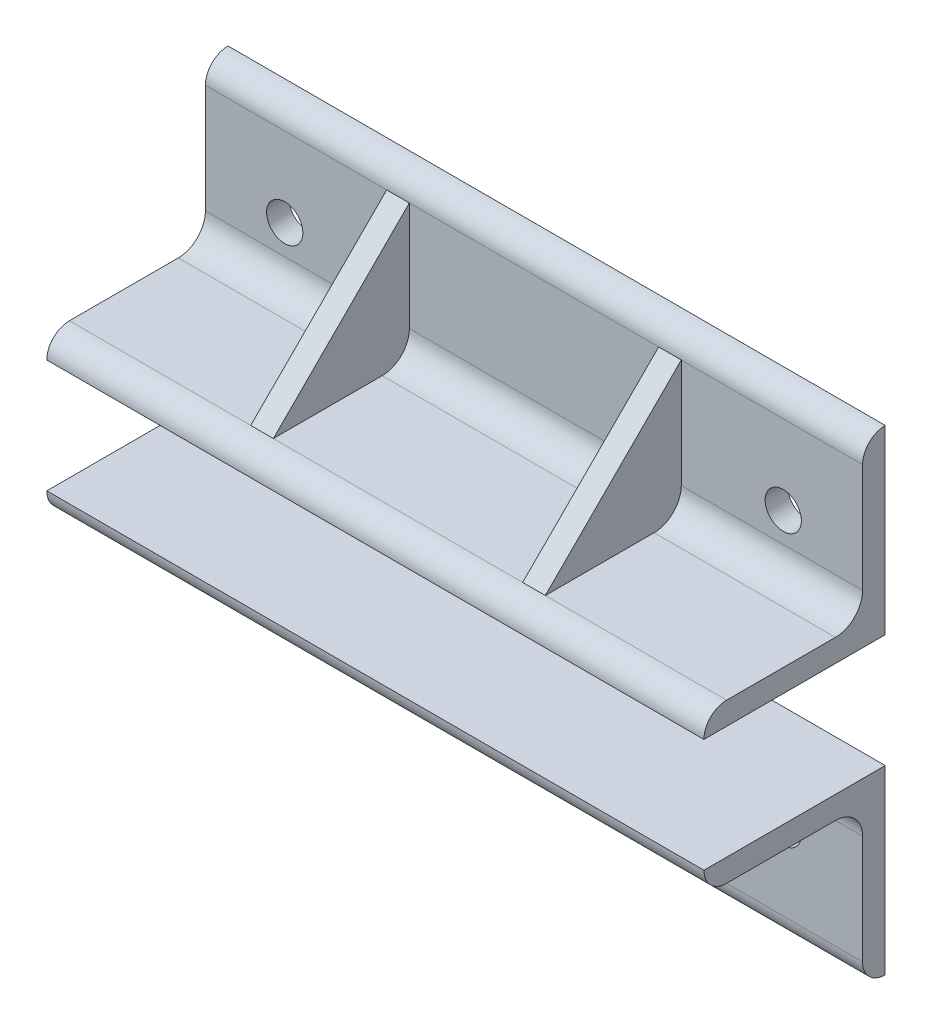
ISO-10303-21;
HEADER;
FILE_DESCRIPTION(('STEP AP214'),'2;1');
FILE_NAME('part.step','',(''),(''),'','','');
FILE_SCHEMA(('AUTOMOTIVE_DESIGN { 1 0 10303 214 1 1 1 1 }'));
ENDSEC;
DATA;
#1=APPLICATION_CONTEXT('core data for automotive mechanical design processes');
#2=APPLICATION_PROTOCOL_DEFINITION('international standard','automotive_design',2000,#1);
#3=PRODUCT_CONTEXT('',#1,'mechanical');
#4=PRODUCT('Part','Part','',(#3));
#5=PRODUCT_RELATED_PRODUCT_CATEGORY('part','',(#4));
#6=PRODUCT_DEFINITION_FORMATION('','',#4);
#7=PRODUCT_DEFINITION_CONTEXT('part definition',#1,'design');
#8=PRODUCT_DEFINITION('design','',#6,#7);
#9=PRODUCT_DEFINITION_SHAPE('','',#8);
#10=(LENGTH_UNIT() NAMED_UNIT(*) SI_UNIT(.MILLI.,.METRE.));
#11=(NAMED_UNIT(*) PLANE_ANGLE_UNIT() SI_UNIT($,.RADIAN.));
#12=(NAMED_UNIT(*) SI_UNIT($,.STERADIAN.) SOLID_ANGLE_UNIT());
#13=UNCERTAINTY_MEASURE_WITH_UNIT(LENGTH_MEASURE(1.E-05),#10,'distance_accuracy_value','');
#14=(GEOMETRIC_REPRESENTATION_CONTEXT(3) GLOBAL_UNCERTAINTY_ASSIGNED_CONTEXT((#13)) GLOBAL_UNIT_ASSIGNED_CONTEXT((#10,
#11,#12)) REPRESENTATION_CONTEXT('',''));
#15=CARTESIAN_POINT('',(0.,0.,0.));
#16=DIRECTION('',(0.,0.,1.));
#17=DIRECTION('',(1.,0.,0.));
#18=AXIS2_PLACEMENT_3D('',#15,#16,#17);
#19=CARTESIAN_POINT('',(-27.5,47.5,5.));
#20=DIRECTION('',(0.,-0.707106781186547,-0.707106781186548));
#21=DIRECTION('',(0.,0.707106781186548,-0.707106781186547));
#22=AXIS2_PLACEMENT_3D('',#19,#20,#21);
#23=PLANE('',#22);
#24=DIRECTION('',(0.,-0.707106781186547,0.707106781186547));
#25=VECTOR('',#24,1.);
#26=CARTESIAN_POINT('',(-32.5,47.5,5.));
#27=LINE('',#26,#25);
#28=CARTESIAN_POINT('',(-32.5,47.5,5.));
#29=VERTEX_POINT('',#28);
#30=CARTESIAN_POINT('',(-32.5,17.5,35.));
#31=VERTEX_POINT('',#30);
#32=EDGE_CURVE('E157',#29,#31,#27,.T.);
#33=ORIENTED_EDGE('',*,*,#32,.T.);
#34=DIRECTION('',(-1.,0.,0.));
#35=VECTOR('',#34,1.);
#36=CARTESIAN_POINT('',(-27.5,17.5,35.));
#37=LINE('',#36,#35);
#38=CARTESIAN_POINT('',(-27.5,17.5,35.));
#39=VERTEX_POINT('',#38);
#40=EDGE_CURVE('E14',#39,#31,#37,.T.);
#41=ORIENTED_EDGE('',*,*,#40,.F.);
#42=DIRECTION('',(0.,-0.707106781186547,0.707106781186547));
#43=VECTOR('',#42,1.);
#44=CARTESIAN_POINT('',(-27.5,47.5,5.));
#45=LINE('',#44,#43);
#46=CARTESIAN_POINT('',(-27.5,47.5,5.));
#47=VERTEX_POINT('',#46);
#48=EDGE_CURVE('E150',#47,#39,#45,.T.);
#49=ORIENTED_EDGE('',*,*,#48,.F.);
#50=DIRECTION('',(-1.,0.,0.));
#51=VECTOR('',#50,1.);
#52=CARTESIAN_POINT('',(-27.5,47.5,5.));
#53=LINE('',#52,#51);
#54=EDGE_CURVE('E158',#47,#29,#53,.T.);
#55=ORIENTED_EDGE('',*,*,#54,.T.);
#56=EDGE_LOOP('',(#33,#41,#49,#55));
#57=FACE_BOUND('',#56,.T.);
#58=ADVANCED_FACE('F110',(#57),#23,.F.);
#59=CARTESIAN_POINT('',(-27.5,17.5,5.));
#60=DIRECTION('',(0.,1.,0.));
#61=DIRECTION('',(0.,0.,1.));
#62=AXIS2_PLACEMENT_3D('',#59,#60,#61);
#63=PLANE('',#62);
#64=DIRECTION('',(0.,0.,-1.));
#65=VECTOR('',#64,1.);
#66=CARTESIAN_POINT('',(-32.5,17.5,5.));
#67=LINE('',#66,#65);
#68=CARTESIAN_POINT('',(-32.5,17.5,5.));
#69=VERTEX_POINT('',#68);
#70=EDGE_CURVE('E138',#31,#69,#67,.T.);
#71=ORIENTED_EDGE('',*,*,#70,.T.);
#72=DIRECTION('',(-1.,0.,0.));
#73=VECTOR('',#72,1.);
#74=CARTESIAN_POINT('',(-27.5,17.5,5.));
#75=LINE('',#74,#73);
#76=CARTESIAN_POINT('',(-27.5,17.5,5.));
#77=VERTEX_POINT('',#76);
#78=EDGE_CURVE('E118',#77,#69,#75,.T.);
#79=ORIENTED_EDGE('',*,*,#78,.F.);
#80=DIRECTION('',(0.,0.,-1.));
#81=VECTOR('',#80,1.);
#82=CARTESIAN_POINT('',(-27.5,17.5,5.));
#83=LINE('',#82,#81);
#84=EDGE_CURVE('E146',#39,#77,#83,.T.);
#85=ORIENTED_EDGE('',*,*,#84,.F.);
#86=ORIENTED_EDGE('',*,*,#40,.T.);
#87=EDGE_LOOP('',(#71,#79,#85,#86));
#88=FACE_BOUND('',#87,.T.);
#89=ADVANCED_FACE('F147',(#88),#63,.F.);
#90=CARTESIAN_POINT('',(-27.5,17.5,5.));
#91=DIRECTION('',(0.,0.,1.));
#92=DIRECTION('',(1.,0.,0.));
#93=AXIS2_PLACEMENT_3D('',#90,#91,#92);
#94=PLANE('',#93);
#95=DIRECTION('',(0.,1.,0.));
#96=VECTOR('',#95,1.);
#97=CARTESIAN_POINT('',(-32.5,17.5,5.));
#98=LINE('',#97,#96);
#99=EDGE_CURVE('E143',#69,#29,#98,.T.);
#100=ORIENTED_EDGE('',*,*,#99,.T.);
#101=ORIENTED_EDGE('',*,*,#54,.F.);
#102=DIRECTION('',(0.,1.,0.));
#103=VECTOR('',#102,1.);
#104=CARTESIAN_POINT('',(-27.5,17.5,5.));
#105=LINE('',#104,#103);
#106=EDGE_CURVE('E126',#77,#47,#105,.T.);
#107=ORIENTED_EDGE('',*,*,#106,.F.);
#108=ORIENTED_EDGE('',*,*,#78,.T.);
#109=EDGE_LOOP('',(#100,#101,#107,#108));
#110=FACE_BOUND('',#109,.T.);
#111=ADVANCED_FACE('F165',(#110),#94,.F.);
#112=CARTESIAN_POINT('',(-27.5,0.,0.));
#113=DIRECTION('',(-1.,0.,0.));
#114=DIRECTION('',(0.,0.,1.));
#115=AXIS2_PLACEMENT_3D('',#112,#113,#114);
#116=PLANE('',#115);
#117=ORIENTED_EDGE('',*,*,#48,.T.);
#118=ORIENTED_EDGE('',*,*,#84,.T.);
#119=ORIENTED_EDGE('',*,*,#106,.T.);
#120=EDGE_LOOP('',(#117,#118,#119));
#121=FACE_BOUND('',#120,.T.);
#122=ADVANCED_FACE('F153',(#121),#116,.F.);
#123=CARTESIAN_POINT('',(-32.5,0.,0.));
#124=DIRECTION('',(-1.,0.,0.));
#125=DIRECTION('',(0.,0.,1.));
#126=AXIS2_PLACEMENT_3D('',#123,#124,#125);
#127=PLANE('',#126);
#128=ORIENTED_EDGE('',*,*,#32,.F.);
#129=ORIENTED_EDGE('',*,*,#99,.F.);
#130=ORIENTED_EDGE('',*,*,#70,.F.);
#131=EDGE_LOOP('',(#128,#129,#130));
#132=FACE_BOUND('',#131,.T.);
#133=ADVANCED_FACE('F166',(#132),#127,.T.);
#134=CLOSED_SHELL('',(#58,#89,#111,#122,#133));
#135=MANIFOLD_SOLID_BREP('B2',#134);
#136=CARTESIAN_POINT('',(27.5,-47.5,4.99999999999988));
#137=DIRECTION('',(0.,0.70710678118655,-0.707106781186545));
#138=DIRECTION('',(0.,0.707106781186545,0.70710678118655));
#139=AXIS2_PLACEMENT_3D('',#136,#137,#138);
#140=PLANE('',#139);
#141=DIRECTION('',(0.,0.707106781186545,0.70710678118655));
#142=VECTOR('',#141,1.);
#143=CARTESIAN_POINT('',(32.5,-47.5,4.99999999999988));
#144=LINE('',#143,#142);
#145=CARTESIAN_POINT('',(32.5,-47.5,4.99999999999988));
#146=VERTEX_POINT('',#145);
#147=CARTESIAN_POINT('',(32.5,-17.5000000000001,35.));
#148=VERTEX_POINT('',#147);
#149=EDGE_CURVE('E265',#146,#148,#144,.T.);
#150=ORIENTED_EDGE('',*,*,#149,.T.);
#151=DIRECTION('',(1.,0.,0.));
#152=VECTOR('',#151,1.);
#153=CARTESIAN_POINT('',(27.5,-17.5000000000001,35.));
#154=LINE('',#153,#152);
#155=CARTESIAN_POINT('',(27.5,-17.5000000000001,35.));
#156=VERTEX_POINT('',#155);
#157=EDGE_CURVE('E108',#156,#148,#154,.T.);
#158=ORIENTED_EDGE('',*,*,#157,.F.);
#159=DIRECTION('',(0.,0.707106781186545,0.70710678118655));
#160=VECTOR('',#159,1.);
#161=CARTESIAN_POINT('',(27.5,-47.5,4.99999999999988));
#162=LINE('',#161,#160);
#163=CARTESIAN_POINT('',(27.5,-47.5,4.99999999999988));
#164=VERTEX_POINT('',#163);
#165=EDGE_CURVE('E258',#164,#156,#162,.T.);
#166=ORIENTED_EDGE('',*,*,#165,.F.);
#167=DIRECTION('',(1.,0.,0.));
#168=VECTOR('',#167,1.);
#169=CARTESIAN_POINT('',(27.5,-47.5,4.99999999999988));
#170=LINE('',#169,#168);
#171=EDGE_CURVE('E266',#164,#146,#170,.T.);
#172=ORIENTED_EDGE('',*,*,#171,.T.);
#173=EDGE_LOOP('',(#150,#158,#166,#172));
#174=FACE_BOUND('',#173,.T.);
#175=ADVANCED_FACE('F218',(#174),#140,.F.);
#176=CARTESIAN_POINT('',(27.5,-17.5,4.99999999999998));
#177=DIRECTION('',(0.,-1.,0.));
#178=DIRECTION('',(0.,0.,-1.));
#179=AXIS2_PLACEMENT_3D('',#176,#177,#178);
#180=PLANE('',#179);
#181=DIRECTION('',(0.,0.,-1.));
#182=VECTOR('',#181,1.);
#183=CARTESIAN_POINT('',(32.5,-17.5,4.99999999999998));
#184=LINE('',#183,#182);
#185=CARTESIAN_POINT('',(32.5,-17.5,4.99999999999998));
#186=VERTEX_POINT('',#185);
#187=EDGE_CURVE('E246',#148,#186,#184,.T.);
#188=ORIENTED_EDGE('',*,*,#187,.T.);
#189=DIRECTION('',(1.,0.,0.));
#190=VECTOR('',#189,1.);
#191=CARTESIAN_POINT('',(27.5,-17.5,4.99999999999998));
#192=LINE('',#191,#190);
#193=CARTESIAN_POINT('',(27.5,-17.5,4.99999999999998));
#194=VERTEX_POINT('',#193);
#195=EDGE_CURVE('E226',#194,#186,#192,.T.);
#196=ORIENTED_EDGE('',*,*,#195,.F.);
#197=DIRECTION('',(0.,0.,-1.));
#198=VECTOR('',#197,1.);
#199=CARTESIAN_POINT('',(27.5,-17.5,4.99999999999998));
#200=LINE('',#199,#198);
#201=EDGE_CURVE('E254',#156,#194,#200,.T.);
#202=ORIENTED_EDGE('',*,*,#201,.F.);
#203=ORIENTED_EDGE('',*,*,#157,.T.);
#204=EDGE_LOOP('',(#188,#196,#202,#203));
#205=FACE_BOUND('',#204,.T.);
#206=ADVANCED_FACE('F255',(#205),#180,.F.);
#207=CARTESIAN_POINT('',(27.5,-17.5,4.99999999999998));
#208=DIRECTION('',(0.,0.,1.));
#209=DIRECTION('',(0.,-1.,0.));
#210=AXIS2_PLACEMENT_3D('',#207,#208,#209);
#211=PLANE('',#210);
#212=DIRECTION('',(0.,-1.,0.));
#213=VECTOR('',#212,1.);
#214=CARTESIAN_POINT('',(32.5,-17.5,4.99999999999998));
#215=LINE('',#214,#213);
#216=EDGE_CURVE('E251',#186,#146,#215,.T.);
#217=ORIENTED_EDGE('',*,*,#216,.T.);
#218=ORIENTED_EDGE('',*,*,#171,.F.);
#219=DIRECTION('',(0.,-1.,0.));
#220=VECTOR('',#219,1.);
#221=CARTESIAN_POINT('',(27.5,-17.5,4.99999999999998));
#222=LINE('',#221,#220);
#223=EDGE_CURVE('E234',#194,#164,#222,.T.);
#224=ORIENTED_EDGE('',*,*,#223,.F.);
#225=ORIENTED_EDGE('',*,*,#195,.T.);
#226=EDGE_LOOP('',(#217,#218,#224,#225));
#227=FACE_BOUND('',#226,.T.);
#228=ADVANCED_FACE('F273',(#227),#211,.F.);
#229=CARTESIAN_POINT('',(27.5,0.,0.));
#230=DIRECTION('',(1.,0.,0.));
#231=DIRECTION('',(0.,0.,-1.));
#232=AXIS2_PLACEMENT_3D('',#229,#230,#231);
#233=PLANE('',#232);
#234=ORIENTED_EDGE('',*,*,#165,.T.);
#235=ORIENTED_EDGE('',*,*,#201,.T.);
#236=ORIENTED_EDGE('',*,*,#223,.T.);
#237=EDGE_LOOP('',(#234,#235,#236));
#238=FACE_BOUND('',#237,.T.);
#239=ADVANCED_FACE('F261',(#238),#233,.F.);
#240=CARTESIAN_POINT('',(32.5,0.,0.));
#241=DIRECTION('',(1.,0.,0.));
#242=DIRECTION('',(0.,0.,-1.));
#243=AXIS2_PLACEMENT_3D('',#240,#241,#242);
#244=PLANE('',#243);
#245=ORIENTED_EDGE('',*,*,#149,.F.);
#246=ORIENTED_EDGE('',*,*,#216,.F.);
#247=ORIENTED_EDGE('',*,*,#187,.F.);
#248=EDGE_LOOP('',(#245,#246,#247));
#249=FACE_BOUND('',#248,.T.);
#250=ADVANCED_FACE('F274',(#249),#244,.T.);
#251=CLOSED_SHELL('',(#175,#206,#228,#239,#250));
#252=MANIFOLD_SOLID_BREP('B8',#251);
#253=CARTESIAN_POINT('',(-30.,-17.5000000000001,35.));
#254=DIRECTION('',(0.,0.70710678118655,-0.707106781186545));
#255=DIRECTION('',(0.,0.707106781186545,0.70710678118655));
#256=AXIS2_PLACEMENT_3D('',#253,#254,#255);
#257=PLANE('',#256);
#258=DIRECTION('',(0.,-0.707106781186545,-0.70710678118655));
#259=VECTOR('',#258,1.);
#260=CARTESIAN_POINT('',(-35.,-17.5000000000001,35.));
#261=LINE('',#260,#259);
#262=CARTESIAN_POINT('',(-35.,-17.5000000000001,35.));
#263=VERTEX_POINT('',#262);
#264=CARTESIAN_POINT('',(-35.,-47.5,4.99999999999988));
#265=VERTEX_POINT('',#264);
#266=EDGE_CURVE('E373',#263,#265,#261,.T.);
#267=ORIENTED_EDGE('',*,*,#266,.T.);
#268=DIRECTION('',(-1.,0.,0.));
#269=VECTOR('',#268,1.);
#270=CARTESIAN_POINT('',(-30.,-47.5,4.99999999999988));
#271=LINE('',#270,#269);
#272=CARTESIAN_POINT('',(-30.,-47.5,4.99999999999988));
#273=VERTEX_POINT('',#272);
#274=EDGE_CURVE('E216',#273,#265,#271,.T.);
#275=ORIENTED_EDGE('',*,*,#274,.F.);
#276=DIRECTION('',(0.,-0.707106781186545,-0.70710678118655));
#277=VECTOR('',#276,1.);
#278=CARTESIAN_POINT('',(-30.,-17.5000000000001,35.));
#279=LINE('',#278,#277);
#280=CARTESIAN_POINT('',(-30.,-17.5000000000001,35.));
#281=VERTEX_POINT('',#280);
#282=EDGE_CURVE('E366',#281,#273,#279,.T.);
#283=ORIENTED_EDGE('',*,*,#282,.F.);
#284=DIRECTION('',(-1.,0.,0.));
#285=VECTOR('',#284,1.);
#286=CARTESIAN_POINT('',(-30.,-17.5000000000001,35.));
#287=LINE('',#286,#285);
#288=EDGE_CURVE('E374',#281,#263,#287,.T.);
#289=ORIENTED_EDGE('',*,*,#288,.T.);
#290=EDGE_LOOP('',(#267,#275,#283,#289));
#291=FACE_BOUND('',#290,.T.);
#292=ADVANCED_FACE('F326',(#291),#257,.F.);
#293=CARTESIAN_POINT('',(-30.,-17.5,4.99999999999998));
#294=DIRECTION('',(0.,0.,1.));
#295=DIRECTION('',(0.,-1.,0.));
#296=AXIS2_PLACEMENT_3D('',#293,#294,#295);
#297=PLANE('',#296);
#298=DIRECTION('',(0.,1.,0.));
#299=VECTOR('',#298,1.);
#300=CARTESIAN_POINT('',(-35.,-17.5,4.99999999999998));
#301=LINE('',#300,#299);
#302=CARTESIAN_POINT('',(-35.,-17.5,4.99999999999998));
#303=VERTEX_POINT('',#302);
#304=EDGE_CURVE('E354',#265,#303,#301,.T.);
#305=ORIENTED_EDGE('',*,*,#304,.T.);
#306=DIRECTION('',(-1.,0.,0.));
#307=VECTOR('',#306,1.);
#308=CARTESIAN_POINT('',(-30.,-17.5,4.99999999999998));
#309=LINE('',#308,#307);
#310=CARTESIAN_POINT('',(-30.,-17.5,4.99999999999998));
#311=VERTEX_POINT('',#310);
#312=EDGE_CURVE('E334',#311,#303,#309,.T.);
#313=ORIENTED_EDGE('',*,*,#312,.F.);
#314=DIRECTION('',(0.,1.,0.));
#315=VECTOR('',#314,1.);
#316=CARTESIAN_POINT('',(-30.,-17.5,4.99999999999998));
#317=LINE('',#316,#315);
#318=EDGE_CURVE('E362',#273,#311,#317,.T.);
#319=ORIENTED_EDGE('',*,*,#318,.F.);
#320=ORIENTED_EDGE('',*,*,#274,.T.);
#321=EDGE_LOOP('',(#305,#313,#319,#320));
#322=FACE_BOUND('',#321,.T.);
#323=ADVANCED_FACE('F363',(#322),#297,.F.);
#324=CARTESIAN_POINT('',(-30.,-17.5,4.99999999999998));
#325=DIRECTION('',(0.,-1.,0.));
#326=DIRECTION('',(0.,0.,-1.));
#327=AXIS2_PLACEMENT_3D('',#324,#325,#326);
#328=PLANE('',#327);
#329=DIRECTION('',(0.,0.,1.));
#330=VECTOR('',#329,1.);
#331=CARTESIAN_POINT('',(-35.,-17.5,4.99999999999998));
#332=LINE('',#331,#330);
#333=EDGE_CURVE('E359',#303,#263,#332,.T.);
#334=ORIENTED_EDGE('',*,*,#333,.T.);
#335=ORIENTED_EDGE('',*,*,#288,.F.);
#336=DIRECTION('',(0.,0.,1.));
#337=VECTOR('',#336,1.);
#338=CARTESIAN_POINT('',(-30.,-17.5,4.99999999999998));
#339=LINE('',#338,#337);
#340=EDGE_CURVE('E342',#311,#281,#339,.T.);
#341=ORIENTED_EDGE('',*,*,#340,.F.);
#342=ORIENTED_EDGE('',*,*,#312,.T.);
#343=EDGE_LOOP('',(#334,#335,#341,#342));
#344=FACE_BOUND('',#343,.T.);
#345=ADVANCED_FACE('F381',(#344),#328,.F.);
#346=CARTESIAN_POINT('',(-30.,0.,0.));
#347=DIRECTION('',(-1.,0.,0.));
#348=DIRECTION('',(0.,0.,1.));
#349=AXIS2_PLACEMENT_3D('',#346,#347,#348);
#350=PLANE('',#349);
#351=ORIENTED_EDGE('',*,*,#282,.T.);
#352=ORIENTED_EDGE('',*,*,#318,.T.);
#353=ORIENTED_EDGE('',*,*,#340,.T.);
#354=EDGE_LOOP('',(#351,#352,#353));
#355=FACE_BOUND('',#354,.T.);
#356=ADVANCED_FACE('F369',(#355),#350,.F.);
#357=CARTESIAN_POINT('',(-35.,0.,0.));
#358=DIRECTION('',(-1.,0.,0.));
#359=DIRECTION('',(0.,0.,1.));
#360=AXIS2_PLACEMENT_3D('',#357,#358,#359);
#361=PLANE('',#360);
#362=ORIENTED_EDGE('',*,*,#266,.F.);
#363=ORIENTED_EDGE('',*,*,#333,.F.);
#364=ORIENTED_EDGE('',*,*,#304,.F.);
#365=EDGE_LOOP('',(#362,#363,#364));
#366=FACE_BOUND('',#365,.T.);
#367=ADVANCED_FACE('F382',(#366),#361,.T.);
#368=CLOSED_SHELL('',(#292,#323,#345,#356,#367));
#369=MANIFOLD_SOLID_BREP('B102',#368);
#370=CARTESIAN_POINT('',(27.5,17.5,35.));
#371=DIRECTION('',(0.,-0.707106781186548,-0.707106781186548));
#372=DIRECTION('',(0.,0.707106781186548,-0.707106781186548));
#373=AXIS2_PLACEMENT_3D('',#370,#371,#372);
#374=PLANE('',#373);
#375=DIRECTION('',(0.,0.707106781186548,-0.707106781186548));
#376=VECTOR('',#375,1.);
#377=CARTESIAN_POINT('',(32.5,17.5,35.));
#378=LINE('',#377,#376);
#379=CARTESIAN_POINT('',(32.5,17.5,35.));
#380=VERTEX_POINT('',#379);
#381=CARTESIAN_POINT('',(32.5,47.5,5.));
#382=VERTEX_POINT('',#381);
#383=EDGE_CURVE('E483',#380,#382,#378,.T.);
#384=ORIENTED_EDGE('',*,*,#383,.T.);
#385=DIRECTION('',(1.,0.,0.));
#386=VECTOR('',#385,1.);
#387=CARTESIAN_POINT('',(27.5,47.5,5.));
#388=LINE('',#387,#386);
#389=CARTESIAN_POINT('',(27.5,47.5,5.));
#390=VERTEX_POINT('',#389);
#391=EDGE_CURVE('E324',#390,#382,#388,.T.);
#392=ORIENTED_EDGE('',*,*,#391,.F.);
#393=DIRECTION('',(0.,0.707106781186548,-0.707106781186548));
#394=VECTOR('',#393,1.);
#395=CARTESIAN_POINT('',(27.5,17.5,35.));
#396=LINE('',#395,#394);
#397=CARTESIAN_POINT('',(27.5,17.5,35.));
#398=VERTEX_POINT('',#397);
#399=EDGE_CURVE('E476',#398,#390,#396,.T.);
#400=ORIENTED_EDGE('',*,*,#399,.F.);
#401=DIRECTION('',(1.,0.,0.));
#402=VECTOR('',#401,1.);
#403=CARTESIAN_POINT('',(27.5,17.5,35.));
#404=LINE('',#403,#402);
#405=EDGE_CURVE('E484',#398,#380,#404,.T.);
#406=ORIENTED_EDGE('',*,*,#405,.T.);
#407=EDGE_LOOP('',(#384,#392,#400,#406));
#408=FACE_BOUND('',#407,.T.);
#409=ADVANCED_FACE('F436',(#408),#374,.F.);
#410=CARTESIAN_POINT('',(27.5,17.5,5.));
#411=DIRECTION('',(0.,0.,1.));
#412=DIRECTION('',(1.,0.,0.));
#413=AXIS2_PLACEMENT_3D('',#410,#411,#412);
#414=PLANE('',#413);
#415=DIRECTION('',(0.,-1.,0.));
#416=VECTOR('',#415,1.);
#417=CARTESIAN_POINT('',(32.5,17.5,5.));
#418=LINE('',#417,#416);
#419=CARTESIAN_POINT('',(32.5,17.5,5.));
#420=VERTEX_POINT('',#419);
#421=EDGE_CURVE('E464',#382,#420,#418,.T.);
#422=ORIENTED_EDGE('',*,*,#421,.T.);
#423=DIRECTION('',(1.,0.,0.));
#424=VECTOR('',#423,1.);
#425=CARTESIAN_POINT('',(27.5,17.5,5.));
#426=LINE('',#425,#424);
#427=CARTESIAN_POINT('',(27.5,17.5,5.));
#428=VERTEX_POINT('',#427);
#429=EDGE_CURVE('E444',#428,#420,#426,.T.);
#430=ORIENTED_EDGE('',*,*,#429,.F.);
#431=DIRECTION('',(0.,-1.,0.));
#432=VECTOR('',#431,1.);
#433=CARTESIAN_POINT('',(27.5,17.5,5.));
#434=LINE('',#433,#432);
#435=EDGE_CURVE('E472',#390,#428,#434,.T.);
#436=ORIENTED_EDGE('',*,*,#435,.F.);
#437=ORIENTED_EDGE('',*,*,#391,.T.);
#438=EDGE_LOOP('',(#422,#430,#436,#437));
#439=FACE_BOUND('',#438,.T.);
#440=ADVANCED_FACE('F473',(#439),#414,.F.);
#441=CARTESIAN_POINT('',(27.5,17.5,5.));
#442=DIRECTION('',(0.,1.,0.));
#443=DIRECTION('',(0.,0.,1.));
#444=AXIS2_PLACEMENT_3D('',#441,#442,#443);
#445=PLANE('',#444);
#446=DIRECTION('',(0.,0.,1.));
#447=VECTOR('',#446,1.);
#448=CARTESIAN_POINT('',(32.5,17.5,5.));
#449=LINE('',#448,#447);
#450=EDGE_CURVE('E469',#420,#380,#449,.T.);
#451=ORIENTED_EDGE('',*,*,#450,.T.);
#452=ORIENTED_EDGE('',*,*,#405,.F.);
#453=DIRECTION('',(0.,0.,1.));
#454=VECTOR('',#453,1.);
#455=CARTESIAN_POINT('',(27.5,17.5,5.));
#456=LINE('',#455,#454);
#457=EDGE_CURVE('E452',#428,#398,#456,.T.);
#458=ORIENTED_EDGE('',*,*,#457,.F.);
#459=ORIENTED_EDGE('',*,*,#429,.T.);
#460=EDGE_LOOP('',(#451,#452,#458,#459));
#461=FACE_BOUND('',#460,.T.);
#462=ADVANCED_FACE('F491',(#461),#445,.F.);
#463=CARTESIAN_POINT('',(27.5,0.,0.));
#464=DIRECTION('',(1.,0.,0.));
#465=DIRECTION('',(0.,0.,-1.));
#466=AXIS2_PLACEMENT_3D('',#463,#464,#465);
#467=PLANE('',#466);
#468=ORIENTED_EDGE('',*,*,#399,.T.);
#469=ORIENTED_EDGE('',*,*,#435,.T.);
#470=ORIENTED_EDGE('',*,*,#457,.T.);
#471=EDGE_LOOP('',(#468,#469,#470));
#472=FACE_BOUND('',#471,.T.);
#473=ADVANCED_FACE('F479',(#472),#467,.F.);
#474=CARTESIAN_POINT('',(32.5,0.,0.));
#475=DIRECTION('',(1.,0.,0.));
#476=DIRECTION('',(0.,0.,-1.));
#477=AXIS2_PLACEMENT_3D('',#474,#475,#476);
#478=PLANE('',#477);
#479=ORIENTED_EDGE('',*,*,#383,.F.);
#480=ORIENTED_EDGE('',*,*,#450,.F.);
#481=ORIENTED_EDGE('',*,*,#421,.F.);
#482=EDGE_LOOP('',(#479,#480,#481));
#483=FACE_BOUND('',#482,.T.);
#484=ADVANCED_FACE('F492',(#483),#478,.T.);
#485=CLOSED_SHELL('',(#409,#440,#462,#473,#484));
#486=MANIFOLD_SOLID_BREP('B210',#485);
#487=CARTESIAN_POINT('',(72.5,-12.5000000000001,40.));
#488=DIRECTION('',(0.,-1.,0.));
#489=DIRECTION('',(0.,0.,-1.));
#490=AXIS2_PLACEMENT_3D('',#487,#488,#489);
#491=PLANE('',#490);
#492=DIRECTION('',(0.,0.,1.));
#493=VECTOR('',#492,1.);
#494=CARTESIAN_POINT('',(-72.5,-12.5000000000001,40.));
#495=LINE('',#494,#493);
#496=CARTESIAN_POINT('',(-72.5,-12.5,0.));
#497=VERTEX_POINT('',#496);
#498=CARTESIAN_POINT('',(-72.5,-12.5000000000001,40.));
#499=VERTEX_POINT('',#498);
#500=EDGE_CURVE('E639',#497,#499,#495,.T.);
#501=ORIENTED_EDGE('',*,*,#500,.T.);
#502=DIRECTION('',(-1.,0.,0.));
#503=VECTOR('',#502,1.);
#504=CARTESIAN_POINT('',(72.5,-12.5000000000001,40.));
#505=LINE('',#504,#503);
#506=CARTESIAN_POINT('',(72.5,-12.5000000000001,40.));
#507=VERTEX_POINT('',#506);
#508=EDGE_CURVE('E434',#507,#499,#505,.T.);
#509=ORIENTED_EDGE('',*,*,#508,.F.);
#510=DIRECTION('',(0.,0.,1.));
#511=VECTOR('',#510,1.);
#512=CARTESIAN_POINT('',(72.5,-12.5000000000001,40.));
#513=LINE('',#512,#511);
#514=CARTESIAN_POINT('',(72.5,-12.5,0.));
#515=VERTEX_POINT('',#514);
#516=EDGE_CURVE('E652',#515,#507,#513,.T.);
#517=ORIENTED_EDGE('',*,*,#516,.F.);
#518=DIRECTION('',(-1.,0.,0.));
#519=VECTOR('',#518,1.);
#520=CARTESIAN_POINT('',(72.5,-12.5,0.));
#521=LINE('',#520,#519);
#522=EDGE_CURVE('E635',#515,#497,#521,.T.);
#523=ORIENTED_EDGE('',*,*,#522,.T.);
#524=EDGE_LOOP('',(#501,#509,#517,#523));
#525=FACE_BOUND('',#524,.T.);
#526=ADVANCED_FACE('F549',(#525),#491,.F.);
#527=CARTESIAN_POINT('',(72.5,-12.5000000000001,35.));
#528=DIRECTION('',(-1.,0.,0.));
#529=DIRECTION('',(0.,0.,1.));
#530=AXIS2_PLACEMENT_3D('',#527,#528,#529);
#531=CYLINDRICAL_SURFACE('',#530,5.);
#532=CARTESIAN_POINT('',(-72.5,-12.5000000000001,35.));
#533=DIRECTION('',(1.,0.,0.));
#534=DIRECTION('',(0.,0.,-1.));
#535=AXIS2_PLACEMENT_3D('',#532,#533,#534);
#536=CIRCLE('',#535,5.);
#537=CARTESIAN_POINT('',(-72.5,-17.5000000000001,35.));
#538=VERTEX_POINT('',#537);
#539=EDGE_CURVE('E642',#499,#538,#536,.T.);
#540=ORIENTED_EDGE('',*,*,#539,.T.);
#541=DIRECTION('',(-1.,0.,0.));
#542=VECTOR('',#541,1.);
#543=CARTESIAN_POINT('',(72.5,-17.5000000000001,35.));
#544=LINE('',#543,#542);
#545=CARTESIAN_POINT('',(72.5,-17.5000000000001,35.));
#546=VERTEX_POINT('',#545);
#547=EDGE_CURVE('E557',#546,#538,#544,.T.);
#548=ORIENTED_EDGE('',*,*,#547,.F.);
#549=CARTESIAN_POINT('',(72.5,-12.5000000000001,35.));
#550=DIRECTION('',(1.,0.,0.));
#551=DIRECTION('',(0.,0.,-1.));
#552=AXIS2_PLACEMENT_3D('',#549,#550,#551);
#553=CIRCLE('',#552,5.);
#554=EDGE_CURVE('E605',#507,#546,#553,.T.);
#555=ORIENTED_EDGE('',*,*,#554,.F.);
#556=ORIENTED_EDGE('',*,*,#508,.T.);
#557=EDGE_LOOP('',(#540,#548,#555,#556));
#558=FACE_BOUND('',#557,.T.);
#559=ADVANCED_FACE('F727',(#558),#531,.T.);
#560=CARTESIAN_POINT('',(72.5,-17.5,11.));
#561=DIRECTION('',(0.,1.,0.));
#562=DIRECTION('',(0.,0.,1.));
#563=AXIS2_PLACEMENT_3D('',#560,#561,#562);
#564=PLANE('',#563);
#565=DIRECTION('',(0.,0.,-1.));
#566=VECTOR('',#565,1.);
#567=CARTESIAN_POINT('',(-72.5,-17.5,11.));
#568=LINE('',#567,#566);
#569=CARTESIAN_POINT('',(-72.5,-17.5,11.));
#570=VERTEX_POINT('',#569);
#571=EDGE_CURVE('E645',#538,#570,#568,.T.);
#572=ORIENTED_EDGE('',*,*,#571,.T.);
#573=DIRECTION('',(-1.,0.,0.));
#574=VECTOR('',#573,1.);
#575=CARTESIAN_POINT('',(72.5,-17.5,11.));
#576=LINE('',#575,#574);
#577=CARTESIAN_POINT('',(72.5,-17.5,11.));
#578=VERTEX_POINT('',#577);
#579=EDGE_CURVE('E656',#578,#570,#576,.T.);
#580=ORIENTED_EDGE('',*,*,#579,.F.);
#581=DIRECTION('',(0.,0.,-1.));
#582=VECTOR('',#581,1.);
#583=CARTESIAN_POINT('',(72.5,-17.5,11.));
#584=LINE('',#583,#582);
#585=EDGE_CURVE('E664',#546,#578,#584,.T.);
#586=ORIENTED_EDGE('',*,*,#585,.F.);
#587=ORIENTED_EDGE('',*,*,#547,.T.);
#588=EDGE_LOOP('',(#572,#580,#586,#587));
#589=FACE_BOUND('',#588,.T.);
#590=ADVANCED_FACE('F662',(#589),#564,.F.);
#591=CARTESIAN_POINT('',(72.5,-23.5,11.));
#592=DIRECTION('',(-1.,0.,0.));
#593=DIRECTION('',(0.,0.,1.));
#594=AXIS2_PLACEMENT_3D('',#591,#592,#593);
#595=CYLINDRICAL_SURFACE('',#594,6.);
#596=CARTESIAN_POINT('',(-72.5,-23.5,11.));
#597=DIRECTION('',(-1.,0.,0.));
#598=DIRECTION('',(0.,0.,1.));
#599=AXIS2_PLACEMENT_3D('',#596,#597,#598);
#600=CIRCLE('',#599,6.);
#601=CARTESIAN_POINT('',(-72.5,-23.5,4.99999999999996));
#602=VERTEX_POINT('',#601);
#603=EDGE_CURVE('E647',#570,#602,#600,.T.);
#604=ORIENTED_EDGE('',*,*,#603,.T.);
#605=DIRECTION('',(-1.,0.,0.));
#606=VECTOR('',#605,1.);
#607=CARTESIAN_POINT('',(72.5,-23.5,4.99999999999996));
#608=LINE('',#607,#606);
#609=CARTESIAN_POINT('',(72.5,-23.5,4.99999999999996));
#610=VERTEX_POINT('',#609);
#611=EDGE_CURVE('E630',#610,#602,#608,.T.);
#612=ORIENTED_EDGE('',*,*,#611,.F.);
#613=CARTESIAN_POINT('',(72.5,-23.5,11.));
#614=DIRECTION('',(-1.,0.,0.));
#615=DIRECTION('',(0.,0.,1.));
#616=AXIS2_PLACEMENT_3D('',#613,#614,#615);
#617=CIRCLE('',#616,6.);
#618=EDGE_CURVE('E621',#578,#610,#617,.T.);
#619=ORIENTED_EDGE('',*,*,#618,.F.);
#620=ORIENTED_EDGE('',*,*,#579,.T.);
#621=EDGE_LOOP('',(#604,#612,#619,#620));
#622=FACE_BOUND('',#621,.T.);
#623=ADVANCED_FACE('F670',(#622),#595,.F.);
#624=CARTESIAN_POINT('',(72.5,-47.5,4.99999999999988));
#625=DIRECTION('',(0.,0.,-1.));
#626=DIRECTION('',(0.,1.,0.));
#627=AXIS2_PLACEMENT_3D('',#624,#625,#626);
#628=PLANE('',#627);
#629=CARTESIAN_POINT('',(-15.,-41.4999999999995,5.));
#630=DIRECTION('',(0.,0.,1.));
#631=DIRECTION('',(1.,0.,0.));
#632=AXIS2_PLACEMENT_3D('',#629,#630,#631);
#633=CIRCLE('',#632,4.24999999999999);
#634=CARTESIAN_POINT('',(-10.75,-41.4999999999995,5.));
#635=VERTEX_POINT('',#634);
#636=EDGE_CURVE('E690',#635,#635,#633,.T.);
#637=ORIENTED_EDGE('',*,*,#636,.F.);
#638=EDGE_LOOP('',(#637));
#639=FACE_BOUND('',#638,.T.);
#640=CARTESIAN_POINT('',(15.0000000000047,-41.4999999999995,5.));
#641=DIRECTION('',(0.,0.,1.));
#642=DIRECTION('',(-1.,0.,0.));
#643=AXIS2_PLACEMENT_3D('',#640,#641,#642);
#644=CIRCLE('',#643,4.24999999999999);
#645=CARTESIAN_POINT('',(10.7500000000047,-41.4999999999995,5.));
#646=VERTEX_POINT('',#645);
#647=EDGE_CURVE('E691',#646,#646,#644,.T.);
#648=ORIENTED_EDGE('',*,*,#647,.F.);
#649=EDGE_LOOP('',(#648));
#650=FACE_BOUND('',#649,.T.);
#651=CARTESIAN_POINT('',(55.,-30.,4.99999999999994));
#652=DIRECTION('',(0.,0.,-1.));
#653=DIRECTION('',(0.,1.,0.));
#654=AXIS2_PLACEMENT_3D('',#651,#652,#653);
#655=CIRCLE('',#654,4.00000000000001);
#656=CARTESIAN_POINT('',(55.,-26.,4.99999999999996));
#657=VERTEX_POINT('',#656);
#658=EDGE_CURVE('E682',#657,#657,#655,.T.);
#659=ORIENTED_EDGE('',*,*,#658,.T.);
#660=EDGE_LOOP('',(#659));
#661=FACE_BOUND('',#660,.T.);
#662=CARTESIAN_POINT('',(-55.,-30.,4.99999999999994));
#663=DIRECTION('',(0.,0.,-1.));
#664=DIRECTION('',(0.,1.,0.));
#665=AXIS2_PLACEMENT_3D('',#662,#663,#664);
#666=CIRCLE('',#665,4.00000000000001);
#667=CARTESIAN_POINT('',(-55.,-26.,4.99999999999996));
#668=VERTEX_POINT('',#667);
#669=EDGE_CURVE('E675',#668,#668,#666,.T.);
#670=ORIENTED_EDGE('',*,*,#669,.T.);
#671=EDGE_LOOP('',(#670));
#672=FACE_BOUND('',#671,.T.);
#673=DIRECTION('',(0.,-1.,0.));
#674=VECTOR('',#673,1.);
#675=CARTESIAN_POINT('',(-72.5,-47.5,4.99999999999988));
#676=LINE('',#675,#674);
#677=CARTESIAN_POINT('',(-72.5,-47.5,4.99999999999988));
#678=VERTEX_POINT('',#677);
#679=EDGE_CURVE('E629',#602,#678,#676,.T.);
#680=ORIENTED_EDGE('',*,*,#679,.T.);
#681=DIRECTION('',(-1.,0.,0.));
#682=VECTOR('',#681,1.);
#683=CARTESIAN_POINT('',(72.5,-47.5,4.99999999999988));
#684=LINE('',#683,#682);
#685=CARTESIAN_POINT('',(72.5,-47.5,4.99999999999988));
#686=VERTEX_POINT('',#685);
#687=EDGE_CURVE('E626',#686,#678,#684,.T.);
#688=ORIENTED_EDGE('',*,*,#687,.F.);
#689=DIRECTION('',(0.,-1.,0.));
#690=VECTOR('',#689,1.);
#691=CARTESIAN_POINT('',(72.5,-47.5,4.99999999999988));
#692=LINE('',#691,#690);
#693=EDGE_CURVE('E615',#610,#686,#692,.T.);
#694=ORIENTED_EDGE('',*,*,#693,.F.);
#695=ORIENTED_EDGE('',*,*,#611,.T.);
#696=EDGE_LOOP('',(#680,#688,#694,#695));
#697=FACE_BOUND('',#696,.T.);
#698=ADVANCED_FACE('F627',(#639,#650,#661,#672,#697),#628,.F.);
#699=CARTESIAN_POINT('',(72.5,-47.5,-1.21430643318376E-13));
#700=DIRECTION('',(-1.,0.,0.));
#701=DIRECTION('',(0.,0.,1.));
#702=AXIS2_PLACEMENT_3D('',#699,#700,#701);
#703=CYLINDRICAL_SURFACE('',#702,5.);
#704=CARTESIAN_POINT('',(-72.5,-47.5,-1.21430643318376E-13));
#705=DIRECTION('',(1.,0.,0.));
#706=DIRECTION('',(0.,0.,-1.));
#707=AXIS2_PLACEMENT_3D('',#704,#705,#706);
#708=CIRCLE('',#707,5.);
#709=CARTESIAN_POINT('',(-72.5,-52.5,-1.38777878078145E-13));
#710=VERTEX_POINT('',#709);
#711=EDGE_CURVE('E591',#678,#710,#708,.T.);
#712=ORIENTED_EDGE('',*,*,#711,.T.);
#713=DIRECTION('',(-1.,0.,0.));
#714=VECTOR('',#713,1.);
#715=CARTESIAN_POINT('',(72.5,-52.5,-1.38777878078145E-13));
#716=LINE('',#715,#714);
#717=CARTESIAN_POINT('',(72.5,-52.5,-1.38777878078145E-13));
#718=VERTEX_POINT('',#717);
#719=EDGE_CURVE('E631',#718,#710,#716,.T.);
#720=ORIENTED_EDGE('',*,*,#719,.F.);
#721=CARTESIAN_POINT('',(72.5,-47.5,-1.21430643318376E-13));
#722=DIRECTION('',(1.,0.,0.));
#723=DIRECTION('',(0.,0.,-1.));
#724=AXIS2_PLACEMENT_3D('',#721,#722,#723);
#725=CIRCLE('',#724,5.);
#726=EDGE_CURVE('E619',#686,#718,#725,.T.);
#727=ORIENTED_EDGE('',*,*,#726,.F.);
#728=ORIENTED_EDGE('',*,*,#687,.T.);
#729=EDGE_LOOP('',(#712,#720,#727,#728));
#730=FACE_BOUND('',#729,.T.);
#731=ADVANCED_FACE('F633',(#730),#703,.T.);
#732=CARTESIAN_POINT('',(72.5,-52.5,-1.38777878078145E-13));
#733=DIRECTION('',(0.,0.,1.));
#734=DIRECTION('',(0.,-1.,0.));
#735=AXIS2_PLACEMENT_3D('',#732,#733,#734);
#736=PLANE('',#735);
#737=CARTESIAN_POINT('',(-15.,-41.4999999999995,-1.00613961606655E-13));
#738=DIRECTION('',(0.,0.,1.));
#739=DIRECTION('',(0.,-1.,0.));
#740=AXIS2_PLACEMENT_3D('',#737,#738,#739);
#741=CIRCLE('',#740,4.24999999999999);
#742=CARTESIAN_POINT('',(-15.,-45.7499999999995,-1.15452757296738E-13));
#743=VERTEX_POINT('',#742);
#744=EDGE_CURVE('E679',#743,#743,#741,.F.);
#745=ORIENTED_EDGE('',*,*,#744,.F.);
#746=EDGE_LOOP('',(#745));
#747=FACE_BOUND('',#746,.T.);
#748=CARTESIAN_POINT('',(15.0000000000047,-41.4999999999995,-1.00613961606655E-13));
#749=DIRECTION('',(0.,0.,1.));
#750=DIRECTION('',(0.,-1.,0.));
#751=AXIS2_PLACEMENT_3D('',#748,#749,#750);
#752=CIRCLE('',#751,4.24999999999999);
#753=CARTESIAN_POINT('',(15.0000000000047,-45.7499999999995,-1.15452757296738E-13));
#754=VERTEX_POINT('',#753);
#755=EDGE_CURVE('E687',#754,#754,#752,.F.);
#756=ORIENTED_EDGE('',*,*,#755,.F.);
#757=EDGE_LOOP('',(#756));
#758=FACE_BOUND('',#757,.T.);
#759=CARTESIAN_POINT('',(55.,-30.,0.));
#760=DIRECTION('',(0.,0.,1.));
#761=DIRECTION('',(1.,0.,0.));
#762=AXIS2_PLACEMENT_3D('',#759,#760,#761);
#763=CIRCLE('',#762,4.00000000000001);
#764=CARTESIAN_POINT('',(59.,-30.,0.));
#765=VERTEX_POINT('',#764);
#766=EDGE_CURVE('E643',#765,#765,#763,.T.);
#767=ORIENTED_EDGE('',*,*,#766,.T.);
#768=EDGE_LOOP('',(#767));
#769=FACE_BOUND('',#768,.T.);
#770=CARTESIAN_POINT('',(-55.,-30.,0.));
#771=DIRECTION('',(0.,0.,1.));
#772=DIRECTION('',(1.,0.,0.));
#773=AXIS2_PLACEMENT_3D('',#770,#771,#772);
#774=CIRCLE('',#773,4.00000000000001);
#775=CARTESIAN_POINT('',(-51.,-30.,0.));
#776=VERTEX_POINT('',#775);
#777=EDGE_CURVE('E678',#776,#776,#774,.T.);
#778=ORIENTED_EDGE('',*,*,#777,.T.);
#779=EDGE_LOOP('',(#778));
#780=FACE_BOUND('',#779,.T.);
#781=DIRECTION('',(0.,1.,0.));
#782=VECTOR('',#781,1.);
#783=CARTESIAN_POINT('',(-72.5,-52.5,-1.38777878078145E-13));
#784=LINE('',#783,#782);
#785=EDGE_CURVE('E597',#710,#497,#784,.T.);
#786=ORIENTED_EDGE('',*,*,#785,.T.);
#787=ORIENTED_EDGE('',*,*,#522,.F.);
#788=DIRECTION('',(0.,1.,0.));
#789=VECTOR('',#788,1.);
#790=CARTESIAN_POINT('',(72.5,-52.5,-1.38777878078145E-13));
#791=LINE('',#790,#789);
#792=EDGE_CURVE('E565',#718,#515,#791,.T.);
#793=ORIENTED_EDGE('',*,*,#792,.F.);
#794=ORIENTED_EDGE('',*,*,#719,.T.);
#795=EDGE_LOOP('',(#786,#787,#793,#794));
#796=FACE_BOUND('',#795,.T.);
#797=ADVANCED_FACE('F734',(#747,#758,#769,#780,#796),#736,.F.);
#798=CARTESIAN_POINT('',(72.5,-47.5,-1.21430643318376E-13));
#799=DIRECTION('',(1.,0.,0.));
#800=DIRECTION('',(0.,0.,-1.));
#801=AXIS2_PLACEMENT_3D('',#798,#799,#800);
#802=PLANE('',#801);
#803=ORIENTED_EDGE('',*,*,#516,.T.);
#804=ORIENTED_EDGE('',*,*,#554,.T.);
#805=ORIENTED_EDGE('',*,*,#585,.T.);
#806=ORIENTED_EDGE('',*,*,#618,.T.);
#807=ORIENTED_EDGE('',*,*,#693,.T.);
#808=ORIENTED_EDGE('',*,*,#726,.T.);
#809=ORIENTED_EDGE('',*,*,#792,.T.);
#810=EDGE_LOOP('',(#803,#804,#805,#806,#807,#808,#809));
#811=FACE_BOUND('',#810,.T.);
#812=ADVANCED_FACE('F617',(#811),#802,.T.);
#813=CARTESIAN_POINT('',(-72.5,-47.5,-1.21430643318376E-13));
#814=DIRECTION('',(1.,0.,0.));
#815=DIRECTION('',(0.,0.,-1.));
#816=AXIS2_PLACEMENT_3D('',#813,#814,#815);
#817=PLANE('',#816);
#818=ORIENTED_EDGE('',*,*,#500,.F.);
#819=ORIENTED_EDGE('',*,*,#785,.F.);
#820=ORIENTED_EDGE('',*,*,#711,.F.);
#821=ORIENTED_EDGE('',*,*,#679,.F.);
#822=ORIENTED_EDGE('',*,*,#603,.F.);
#823=ORIENTED_EDGE('',*,*,#571,.F.);
#824=ORIENTED_EDGE('',*,*,#539,.F.);
#825=EDGE_LOOP('',(#818,#819,#820,#821,#822,#823,#824));
#826=FACE_BOUND('',#825,.T.);
#827=ADVANCED_FACE('F668',(#826),#817,.F.);
#828=CARTESIAN_POINT('',(-55.,-30.,40.001));
#829=DIRECTION('',(0.,0.,-1.));
#830=DIRECTION('',(-1.,0.,0.));
#831=AXIS2_PLACEMENT_3D('',#828,#829,#830);
#832=CYLINDRICAL_SURFACE('',#831,4.00000000000001);
#833=ORIENTED_EDGE('',*,*,#777,.F.);
#834=EDGE_LOOP('',(#833));
#835=FACE_BOUND('',#834,.T.);
#836=ORIENTED_EDGE('',*,*,#669,.F.);
#837=EDGE_LOOP('',(#836));
#838=FACE_BOUND('',#837,.T.);
#839=ADVANCED_FACE('F711',(#835,#838),#832,.F.);
#840=CARTESIAN_POINT('',(55.,-30.,40.001));
#841=DIRECTION('',(0.,0.,-1.));
#842=DIRECTION('',(-1.,0.,0.));
#843=AXIS2_PLACEMENT_3D('',#840,#841,#842);
#844=CYLINDRICAL_SURFACE('',#843,4.00000000000001);
#845=ORIENTED_EDGE('',*,*,#766,.F.);
#846=EDGE_LOOP('',(#845));
#847=FACE_BOUND('',#846,.T.);
#848=ORIENTED_EDGE('',*,*,#658,.F.);
#849=EDGE_LOOP('',(#848));
#850=FACE_BOUND('',#849,.T.);
#851=ADVANCED_FACE('F713',(#847,#850),#844,.F.);
#852=CARTESIAN_POINT('',(15.0000000000047,-41.4999999999995,-0.00100000000013978));
#853=DIRECTION('',(0.,0.,1.));
#854=DIRECTION('',(1.,0.,0.));
#855=AXIS2_PLACEMENT_3D('',#852,#853,#854);
#856=CYLINDRICAL_SURFACE('',#855,4.24999999999999);
#857=ORIENTED_EDGE('',*,*,#647,.T.);
#858=EDGE_LOOP('',(#857));
#859=FACE_BOUND('',#858,.T.);
#860=ORIENTED_EDGE('',*,*,#755,.T.);
#861=EDGE_LOOP('',(#860));
#862=FACE_BOUND('',#861,.T.);
#863=ADVANCED_FACE('F720',(#859,#862),#856,.F.);
#864=CARTESIAN_POINT('',(-15.,-41.4999999999995,-0.00100000000013978));
#865=DIRECTION('',(0.,0.,1.));
#866=DIRECTION('',(1.,0.,0.));
#867=AXIS2_PLACEMENT_3D('',#864,#865,#866);
#868=CYLINDRICAL_SURFACE('',#867,4.24999999999999);
#869=ORIENTED_EDGE('',*,*,#636,.T.);
#870=EDGE_LOOP('',(#869));
#871=FACE_BOUND('',#870,.T.);
#872=ORIENTED_EDGE('',*,*,#744,.T.);
#873=EDGE_LOOP('',(#872));
#874=FACE_BOUND('',#873,.T.);
#875=ADVANCED_FACE('F699',(#871,#874),#868,.F.);
#876=CLOSED_SHELL('',(#526,#559,#590,#623,#698,#731,#797,#812,#827,#839,#851,#863,#875));
#877=MANIFOLD_SOLID_BREP('B318',#876);
#878=CARTESIAN_POINT('',(72.5,52.5,0.));
#879=DIRECTION('',(0.,0.,1.));
#880=DIRECTION('',(1.,0.,0.));
#881=AXIS2_PLACEMENT_3D('',#878,#879,#880);
#882=PLANE('',#881);
#883=CARTESIAN_POINT('',(-55.,30.,0.));
#884=DIRECTION('',(0.,0.,1.));
#885=DIRECTION('',(1.,0.,0.));
#886=AXIS2_PLACEMENT_3D('',#883,#884,#885);
#887=CIRCLE('',#886,4.00000000000001);
#888=CARTESIAN_POINT('',(-51.,30.,0.));
#889=VERTEX_POINT('',#888);
#890=EDGE_CURVE('E947',#889,#889,#887,.T.);
#891=ORIENTED_EDGE('',*,*,#890,.T.);
#892=EDGE_LOOP('',(#891));
#893=FACE_BOUND('',#892,.T.);
#894=CARTESIAN_POINT('',(55.,30.,0.));
#895=DIRECTION('',(0.,0.,1.));
#896=DIRECTION('',(1.,0.,0.));
#897=AXIS2_PLACEMENT_3D('',#894,#895,#896);
#898=CIRCLE('',#897,4.00000000000001);
#899=CARTESIAN_POINT('',(59.,30.,0.));
#900=VERTEX_POINT('',#899);
#901=EDGE_CURVE('E982',#900,#900,#898,.T.);
#902=ORIENTED_EDGE('',*,*,#901,.T.);
#903=EDGE_LOOP('',(#902));
#904=FACE_BOUND('',#903,.T.);
#905=DIRECTION('',(0.,1.,0.));
#906=VECTOR('',#905,1.);
#907=CARTESIAN_POINT('',(-72.5,52.5,0.));
#908=LINE('',#907,#906);
#909=CARTESIAN_POINT('',(-72.5,12.5,0.));
#910=VERTEX_POINT('',#909);
#911=CARTESIAN_POINT('',(-72.5,52.5,0.));
#912=VERTEX_POINT('',#911);
#913=EDGE_CURVE('E943',#910,#912,#908,.T.);
#914=ORIENTED_EDGE('',*,*,#913,.T.);
#915=DIRECTION('',(-1.,0.,0.));
#916=VECTOR('',#915,1.);
#917=CARTESIAN_POINT('',(72.5,52.5,0.));
#918=LINE('',#917,#916);
#919=CARTESIAN_POINT('',(72.5,52.5,0.));
#920=VERTEX_POINT('',#919);
#921=EDGE_CURVE('E547',#920,#912,#918,.T.);
#922=ORIENTED_EDGE('',*,*,#921,.F.);
#923=DIRECTION('',(0.,1.,0.));
#924=VECTOR('',#923,1.);
#925=CARTESIAN_POINT('',(72.5,52.5,0.));
#926=LINE('',#925,#924);
#927=CARTESIAN_POINT('',(72.5,12.5,0.));
#928=VERTEX_POINT('',#927);
#929=EDGE_CURVE('E956',#928,#920,#926,.T.);
#930=ORIENTED_EDGE('',*,*,#929,.F.);
#931=DIRECTION('',(-1.,0.,0.));
#932=VECTOR('',#931,1.);
#933=CARTESIAN_POINT('',(72.5,12.5,0.));
#934=LINE('',#933,#932);
#935=EDGE_CURVE('E939',#928,#910,#934,.T.);
#936=ORIENTED_EDGE('',*,*,#935,.T.);
#937=EDGE_LOOP('',(#914,#922,#930,#936));
#938=FACE_BOUND('',#937,.T.);
#939=ADVANCED_FACE('F853',(#893,#904,#938),#882,.F.);
#940=CARTESIAN_POINT('',(72.5,47.5,0.));
#941=DIRECTION('',(-1.,0.,0.));
#942=DIRECTION('',(0.,0.,1.));
#943=AXIS2_PLACEMENT_3D('',#940,#941,#942);
#944=CYLINDRICAL_SURFACE('',#943,5.);
#945=CARTESIAN_POINT('',(-72.5,47.5,0.));
#946=DIRECTION('',(1.,0.,0.));
#947=DIRECTION('',(0.,0.,-1.));
#948=AXIS2_PLACEMENT_3D('',#945,#946,#947);
#949=CIRCLE('',#948,5.);
#950=CARTESIAN_POINT('',(-72.5,47.5,5.));
#951=VERTEX_POINT('',#950);
#952=EDGE_CURVE('E946',#912,#951,#949,.T.);
#953=ORIENTED_EDGE('',*,*,#952,.T.);
#954=DIRECTION('',(-1.,0.,0.));
#955=VECTOR('',#954,1.);
#956=CARTESIAN_POINT('',(72.5,47.5,5.));
#957=LINE('',#956,#955);
#958=CARTESIAN_POINT('',(72.5,47.5,5.));
#959=VERTEX_POINT('',#958);
#960=EDGE_CURVE('E861',#959,#951,#957,.T.);
#961=ORIENTED_EDGE('',*,*,#960,.F.);
#962=CARTESIAN_POINT('',(72.5,47.5,0.));
#963=DIRECTION('',(1.,0.,0.));
#964=DIRECTION('',(0.,0.,-1.));
#965=AXIS2_PLACEMENT_3D('',#962,#963,#964);
#966=CIRCLE('',#965,5.);
#967=EDGE_CURVE('E909',#920,#959,#966,.T.);
#968=ORIENTED_EDGE('',*,*,#967,.F.);
#969=ORIENTED_EDGE('',*,*,#921,.T.);
#970=EDGE_LOOP('',(#953,#961,#968,#969));
#971=FACE_BOUND('',#970,.T.);
#972=ADVANCED_FACE('F1002',(#971),#944,.T.);
#973=CARTESIAN_POINT('',(72.5,23.5,5.));
#974=DIRECTION('',(0.,0.,-1.));
#975=DIRECTION('',(-1.,0.,0.));
#976=AXIS2_PLACEMENT_3D('',#973,#974,#975);
#977=PLANE('',#976);
#978=CARTESIAN_POINT('',(-55.,30.,5.));
#979=DIRECTION('',(0.,0.,-1.));
#980=DIRECTION('',(-1.,0.,0.));
#981=AXIS2_PLACEMENT_3D('',#978,#979,#980);
#982=CIRCLE('',#981,4.00000000000001);
#983=CARTESIAN_POINT('',(-59.,30.,5.));
#984=VERTEX_POINT('',#983);
#985=EDGE_CURVE('E985',#984,#984,#982,.T.);
#986=ORIENTED_EDGE('',*,*,#985,.T.);
#987=EDGE_LOOP('',(#986));
#988=FACE_BOUND('',#987,.T.);
#989=CARTESIAN_POINT('',(55.,30.,5.));
#990=DIRECTION('',(0.,0.,-1.));
#991=DIRECTION('',(-1.,0.,0.));
#992=AXIS2_PLACEMENT_3D('',#989,#990,#991);
#993=CIRCLE('',#992,4.00000000000001);
#994=CARTESIAN_POINT('',(51.,30.,5.));
#995=VERTEX_POINT('',#994);
#996=EDGE_CURVE('E979',#995,#995,#993,.T.);
#997=ORIENTED_EDGE('',*,*,#996,.T.);
#998=EDGE_LOOP('',(#997));
#999=FACE_BOUND('',#998,.T.);
#1000=DIRECTION('',(0.,-1.,0.));
#1001=VECTOR('',#1000,1.);
#1002=CARTESIAN_POINT('',(-72.5,23.5,5.));
#1003=LINE('',#1002,#1001);
#1004=CARTESIAN_POINT('',(-72.5,23.5,5.));
#1005=VERTEX_POINT('',#1004);
#1006=EDGE_CURVE('E949',#951,#1005,#1003,.T.);
#1007=ORIENTED_EDGE('',*,*,#1006,.T.);
#1008=DIRECTION('',(-1.,0.,0.));
#1009=VECTOR('',#1008,1.);
#1010=CARTESIAN_POINT('',(72.5,23.5,5.));
#1011=LINE('',#1010,#1009);
#1012=CARTESIAN_POINT('',(72.5,23.5,5.));
#1013=VERTEX_POINT('',#1012);
#1014=EDGE_CURVE('E960',#1013,#1005,#1011,.T.);
#1015=ORIENTED_EDGE('',*,*,#1014,.F.);
#1016=DIRECTION('',(0.,-1.,0.));
#1017=VECTOR('',#1016,1.);
#1018=CARTESIAN_POINT('',(72.5,23.5,5.));
#1019=LINE('',#1018,#1017);
#1020=EDGE_CURVE('E968',#959,#1013,#1019,.T.);
#1021=ORIENTED_EDGE('',*,*,#1020,.F.);
#1022=ORIENTED_EDGE('',*,*,#960,.T.);
#1023=EDGE_LOOP('',(#1007,#1015,#1021,#1022));
#1024=FACE_BOUND('',#1023,.T.);
#1025=ADVANCED_FACE('F966',(#988,#999,#1024),#977,.F.);
#1026=CARTESIAN_POINT('',(72.5,23.5,11.));
#1027=DIRECTION('',(-1.,0.,0.));
#1028=DIRECTION('',(0.,0.,1.));
#1029=AXIS2_PLACEMENT_3D('',#1026,#1027,#1028);
#1030=CYLINDRICAL_SURFACE('',#1029,6.);
#1031=CARTESIAN_POINT('',(-72.5,23.5,11.));
#1032=DIRECTION('',(-1.,0.,0.));
#1033=DIRECTION('',(0.,0.,1.));
#1034=AXIS2_PLACEMENT_3D('',#1031,#1032,#1033);
#1035=CIRCLE('',#1034,6.);
#1036=CARTESIAN_POINT('',(-72.5,17.5,11.));
#1037=VERTEX_POINT('',#1036);
#1038=EDGE_CURVE('E951',#1005,#1037,#1035,.T.);
#1039=ORIENTED_EDGE('',*,*,#1038,.T.);
#1040=DIRECTION('',(-1.,0.,0.));
#1041=VECTOR('',#1040,1.);
#1042=CARTESIAN_POINT('',(72.5,17.5,11.));
#1043=LINE('',#1042,#1041);
#1044=CARTESIAN_POINT('',(72.5,17.5,11.));
#1045=VERTEX_POINT('',#1044);
#1046=EDGE_CURVE('E934',#1045,#1037,#1043,.T.);
#1047=ORIENTED_EDGE('',*,*,#1046,.F.);
#1048=CARTESIAN_POINT('',(72.5,23.5,11.));
#1049=DIRECTION('',(-1.,0.,0.));
#1050=DIRECTION('',(0.,0.,1.));
#1051=AXIS2_PLACEMENT_3D('',#1048,#1049,#1050);
#1052=CIRCLE('',#1051,6.);
#1053=EDGE_CURVE('E925',#1013,#1045,#1052,.T.);
#1054=ORIENTED_EDGE('',*,*,#1053,.F.);
#1055=ORIENTED_EDGE('',*,*,#1014,.T.);
#1056=EDGE_LOOP('',(#1039,#1047,#1054,#1055));
#1057=FACE_BOUND('',#1056,.T.);
#1058=ADVANCED_FACE('F974',(#1057),#1030,.F.);
#1059=CARTESIAN_POINT('',(72.5,17.5,35.));
#1060=DIRECTION('',(0.,-1.,0.));
#1061=DIRECTION('',(0.,0.,-1.));
#1062=AXIS2_PLACEMENT_3D('',#1059,#1060,#1061);
#1063=PLANE('',#1062);
#1064=DIRECTION('',(0.,0.,1.));
#1065=VECTOR('',#1064,1.);
#1066=CARTESIAN_POINT('',(-72.5,17.5,35.));
#1067=LINE('',#1066,#1065);
#1068=CARTESIAN_POINT('',(-72.5,17.5,35.));
#1069=VERTEX_POINT('',#1068);
#1070=EDGE_CURVE('E933',#1037,#1069,#1067,.T.);
#1071=ORIENTED_EDGE('',*,*,#1070,.T.);
#1072=DIRECTION('',(-1.,0.,0.));
#1073=VECTOR('',#1072,1.);
#1074=CARTESIAN_POINT('',(72.5,17.5,35.));
#1075=LINE('',#1074,#1073);
#1076=CARTESIAN_POINT('',(72.5,17.5,35.));
#1077=VERTEX_POINT('',#1076);
#1078=EDGE_CURVE('E930',#1077,#1069,#1075,.T.);
#1079=ORIENTED_EDGE('',*,*,#1078,.F.);
#1080=DIRECTION('',(0.,0.,1.));
#1081=VECTOR('',#1080,1.);
#1082=CARTESIAN_POINT('',(72.5,17.5,35.));
#1083=LINE('',#1082,#1081);
#1084=EDGE_CURVE('E919',#1045,#1077,#1083,.T.);
#1085=ORIENTED_EDGE('',*,*,#1084,.F.);
#1086=ORIENTED_EDGE('',*,*,#1046,.T.);
#1087=EDGE_LOOP('',(#1071,#1079,#1085,#1086));
#1088=FACE_BOUND('',#1087,.T.);
#1089=ADVANCED_FACE('F931',(#1088),#1063,.F.);
#1090=CARTESIAN_POINT('',(72.5,12.5,35.));
#1091=DIRECTION('',(-1.,0.,0.));
#1092=DIRECTION('',(0.,0.,1.));
#1093=AXIS2_PLACEMENT_3D('',#1090,#1091,#1092);
#1094=CYLINDRICAL_SURFACE('',#1093,5.);
#1095=CARTESIAN_POINT('',(-72.5,12.5,35.));
#1096=DIRECTION('',(1.,0.,0.));
#1097=DIRECTION('',(0.,0.,-1.));
#1098=AXIS2_PLACEMENT_3D('',#1095,#1096,#1097);
#1099=CIRCLE('',#1098,5.);
#1100=CARTESIAN_POINT('',(-72.5,12.5,40.));
#1101=VERTEX_POINT('',#1100);
#1102=EDGE_CURVE('E895',#1069,#1101,#1099,.T.);
#1103=ORIENTED_EDGE('',*,*,#1102,.T.);
#1104=DIRECTION('',(-1.,0.,0.));
#1105=VECTOR('',#1104,1.);
#1106=CARTESIAN_POINT('',(72.5,12.5,40.));
#1107=LINE('',#1106,#1105);
#1108=CARTESIAN_POINT('',(72.5,12.5,40.));
#1109=VERTEX_POINT('',#1108);
#1110=EDGE_CURVE('E935',#1109,#1101,#1107,.T.);
#1111=ORIENTED_EDGE('',*,*,#1110,.F.);
#1112=CARTESIAN_POINT('',(72.5,12.5,35.));
#1113=DIRECTION('',(1.,0.,0.));
#1114=DIRECTION('',(0.,0.,-1.));
#1115=AXIS2_PLACEMENT_3D('',#1112,#1113,#1114);
#1116=CIRCLE('',#1115,5.);
#1117=EDGE_CURVE('E923',#1077,#1109,#1116,.T.);
#1118=ORIENTED_EDGE('',*,*,#1117,.F.);
#1119=ORIENTED_EDGE('',*,*,#1078,.T.);
#1120=EDGE_LOOP('',(#1103,#1111,#1118,#1119));
#1121=FACE_BOUND('',#1120,.T.);
#1122=ADVANCED_FACE('F937',(#1121),#1094,.T.);
#1123=CARTESIAN_POINT('',(72.5,12.5,40.));
#1124=DIRECTION('',(0.,1.,0.));
#1125=DIRECTION('',(0.,0.,1.));
#1126=AXIS2_PLACEMENT_3D('',#1123,#1124,#1125);
#1127=PLANE('',#1126);
#1128=DIRECTION('',(0.,0.,-1.));
#1129=VECTOR('',#1128,1.);
#1130=CARTESIAN_POINT('',(-72.5,12.5,40.));
#1131=LINE('',#1130,#1129);
#1132=EDGE_CURVE('E901',#1101,#910,#1131,.T.);
#1133=ORIENTED_EDGE('',*,*,#1132,.T.);
#1134=ORIENTED_EDGE('',*,*,#935,.F.);
#1135=DIRECTION('',(0.,0.,-1.));
#1136=VECTOR('',#1135,1.);
#1137=CARTESIAN_POINT('',(72.5,12.5,40.));
#1138=LINE('',#1137,#1136);
#1139=EDGE_CURVE('E869',#1109,#928,#1138,.T.);
#1140=ORIENTED_EDGE('',*,*,#1139,.F.);
#1141=ORIENTED_EDGE('',*,*,#1110,.T.);
#1142=EDGE_LOOP('',(#1133,#1134,#1140,#1141));
#1143=FACE_BOUND('',#1142,.T.);
#1144=ADVANCED_FACE('F1028',(#1143),#1127,.F.);
#1145=CARTESIAN_POINT('',(72.5,12.5,35.));
#1146=DIRECTION('',(1.,0.,0.));
#1147=DIRECTION('',(0.,0.,-1.));
#1148=AXIS2_PLACEMENT_3D('',#1145,#1146,#1147);
#1149=PLANE('',#1148);
#1150=ORIENTED_EDGE('',*,*,#929,.T.);
#1151=ORIENTED_EDGE('',*,*,#967,.T.);
#1152=ORIENTED_EDGE('',*,*,#1020,.T.);
#1153=ORIENTED_EDGE('',*,*,#1053,.T.);
#1154=ORIENTED_EDGE('',*,*,#1084,.T.);
#1155=ORIENTED_EDGE('',*,*,#1117,.T.);
#1156=ORIENTED_EDGE('',*,*,#1139,.T.);
#1157=EDGE_LOOP('',(#1150,#1151,#1152,#1153,#1154,#1155,#1156));
#1158=FACE_BOUND('',#1157,.T.);
#1159=ADVANCED_FACE('F921',(#1158),#1149,.T.);
#1160=CARTESIAN_POINT('',(-72.5,12.5,35.));
#1161=DIRECTION('',(1.,0.,0.));
#1162=DIRECTION('',(0.,0.,-1.));
#1163=AXIS2_PLACEMENT_3D('',#1160,#1161,#1162);
#1164=PLANE('',#1163);
#1165=ORIENTED_EDGE('',*,*,#913,.F.);
#1166=ORIENTED_EDGE('',*,*,#1132,.F.);
#1167=ORIENTED_EDGE('',*,*,#1102,.F.);
#1168=ORIENTED_EDGE('',*,*,#1070,.F.);
#1169=ORIENTED_EDGE('',*,*,#1038,.F.);
#1170=ORIENTED_EDGE('',*,*,#1006,.F.);
#1171=ORIENTED_EDGE('',*,*,#952,.F.);
#1172=EDGE_LOOP('',(#1165,#1166,#1167,#1168,#1169,#1170,#1171));
#1173=FACE_BOUND('',#1172,.T.);
#1174=ADVANCED_FACE('F972',(#1173),#1164,.F.);
#1175=CARTESIAN_POINT('',(55.,30.,40.001));
#1176=DIRECTION('',(0.,0.,-1.));
#1177=DIRECTION('',(-1.,0.,0.));
#1178=AXIS2_PLACEMENT_3D('',#1175,#1176,#1177);
#1179=CYLINDRICAL_SURFACE('',#1178,4.00000000000001);
#1180=ORIENTED_EDGE('',*,*,#901,.F.);
#1181=EDGE_LOOP('',(#1180));
#1182=FACE_BOUND('',#1181,.T.);
#1183=ORIENTED_EDGE('',*,*,#996,.F.);
#1184=EDGE_LOOP('',(#1183));
#1185=FACE_BOUND('',#1184,.T.);
#1186=ADVANCED_FACE('F996',(#1182,#1185),#1179,.F.);
#1187=CARTESIAN_POINT('',(-55.,30.,40.001));
#1188=DIRECTION('',(0.,0.,-1.));
#1189=DIRECTION('',(-1.,0.,0.));
#1190=AXIS2_PLACEMENT_3D('',#1187,#1188,#1189);
#1191=CYLINDRICAL_SURFACE('',#1190,4.00000000000001);
#1192=ORIENTED_EDGE('',*,*,#890,.F.);
#1193=EDGE_LOOP('',(#1192));
#1194=FACE_BOUND('',#1193,.T.);
#1195=ORIENTED_EDGE('',*,*,#985,.F.);
#1196=EDGE_LOOP('',(#1195));
#1197=FACE_BOUND('',#1196,.T.);
#1198=ADVANCED_FACE('F993',(#1194,#1197),#1191,.F.);
#1199=CLOSED_SHELL('',(#939,#972,#1025,#1058,#1089,#1122,#1144,#1159,#1174,#1186,#1198));
#1200=MANIFOLD_SOLID_BREP('B428',#1199);
#1201=ADVANCED_BREP_SHAPE_REPRESENTATION('',(#18,#135,#252,#369,#486,#877,#1200),#14);
#1202=SHAPE_DEFINITION_REPRESENTATION(#9,#1201);
ENDSEC;
END-ISO-10303-21;
